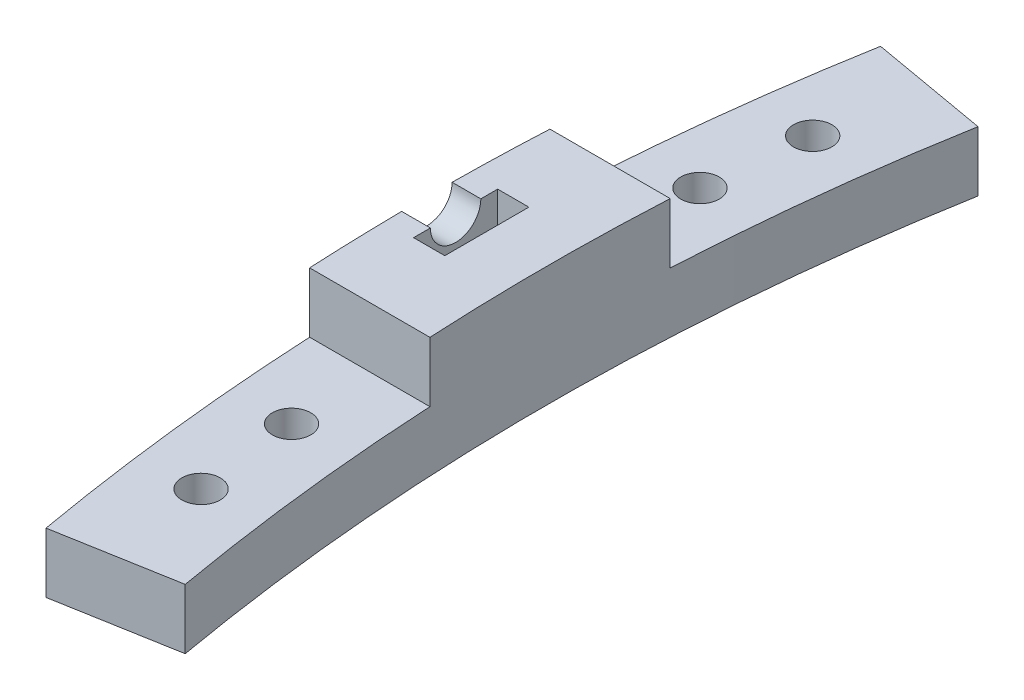
ISO-10303-21;
HEADER;
FILE_DESCRIPTION(('STEP AP214'),'2;1');
FILE_NAME('part.step','',(''),(''),'','','');
FILE_SCHEMA(('AUTOMOTIVE_DESIGN { 1 0 10303 214 1 1 1 1 }'));
ENDSEC;
DATA;
#1=APPLICATION_CONTEXT('core data for automotive mechanical design processes');
#2=APPLICATION_PROTOCOL_DEFINITION('international standard','automotive_design',2000,#1);
#3=PRODUCT_CONTEXT('',#1,'mechanical');
#4=PRODUCT('Part','Part','',(#3));
#5=PRODUCT_RELATED_PRODUCT_CATEGORY('part','',(#4));
#6=PRODUCT_DEFINITION_FORMATION('','',#4);
#7=PRODUCT_DEFINITION_CONTEXT('part definition',#1,'design');
#8=PRODUCT_DEFINITION('design','',#6,#7);
#9=PRODUCT_DEFINITION_SHAPE('','',#8);
#10=(LENGTH_UNIT() NAMED_UNIT(*) SI_UNIT(.MILLI.,.METRE.));
#11=(NAMED_UNIT(*) PLANE_ANGLE_UNIT() SI_UNIT($,.RADIAN.));
#12=(NAMED_UNIT(*) SI_UNIT($,.STERADIAN.) SOLID_ANGLE_UNIT());
#13=UNCERTAINTY_MEASURE_WITH_UNIT(LENGTH_MEASURE(1.E-05),#10,'distance_accuracy_value','');
#14=(GEOMETRIC_REPRESENTATION_CONTEXT(3) GLOBAL_UNCERTAINTY_ASSIGNED_CONTEXT((#13)) GLOBAL_UNIT_ASSIGNED_CONTEXT((#10,
#11,#12)) REPRESENTATION_CONTEXT('',''));
#15=CARTESIAN_POINT('',(0.,0.,0.));
#16=DIRECTION('',(0.,0.,1.));
#17=DIRECTION('',(1.,0.,0.));
#18=AXIS2_PLACEMENT_3D('',#15,#16,#17);
#19=CARTESIAN_POINT('',(0.,10.,0.));
#20=DIRECTION('',(0.,1.,0.));
#21=DIRECTION('',(0.,0.,1.));
#22=AXIS2_PLACEMENT_3D('',#19,#20,#21);
#23=PLANE('',#22);
#24=DIRECTION('',(0.,0.,-1.));
#25=VECTOR('',#24,1.);
#26=CARTESIAN_POINT('',(-197.6,10.,0.));
#27=LINE('',#26,#25);
#28=CARTESIAN_POINT('',(-197.6,10.,3.5));
#29=VERTEX_POINT('',#28);
#30=CARTESIAN_POINT('',(-197.6,10.,2.10000000000002));
#31=VERTEX_POINT('',#30);
#32=EDGE_CURVE('E11',#29,#31,#27,.T.);
#33=ORIENTED_EDGE('',*,*,#32,.T.);
#34=DIRECTION('',(1.,0.,0.));
#35=VECTOR('',#34,1.);
#36=CARTESIAN_POINT('',(-200.,10.,2.10000000000002));
#37=LINE('',#36,#35);
#38=CARTESIAN_POINT('',(-199.988974696107,10.,2.10000000000002));
#39=VERTEX_POINT('',#38);
#40=EDGE_CURVE('E48',#31,#39,#37,.F.);
#41=ORIENTED_EDGE('',*,*,#40,.T.);
#42=CARTESIAN_POINT('',(0.,10.,0.));
#43=DIRECTION('',(0.,1.,0.));
#44=DIRECTION('',(0.,0.,1.));
#45=AXIS2_PLACEMENT_3D('',#42,#43,#44);
#46=CIRCLE('',#45,200.);
#47=CARTESIAN_POINT('',(-199.749843554382,10.,10.));
#48=VERTEX_POINT('',#47);
#49=EDGE_CURVE('E206',#39,#48,#46,.T.);
#50=ORIENTED_EDGE('',*,*,#49,.T.);
#51=DIRECTION('',(1.,0.,0.));
#52=VECTOR('',#51,1.);
#53=CARTESIAN_POINT('',(-199.749843554382,10.,10.));
#54=LINE('',#53,#52);
#55=CARTESIAN_POINT('',(-189.736659610103,10.,9.99999999999993));
#56=VERTEX_POINT('',#55);
#57=EDGE_CURVE('E214',#48,#56,#54,.T.);
#58=ORIENTED_EDGE('',*,*,#57,.T.);
#59=CARTESIAN_POINT('',(0.,10.,0.));
#60=DIRECTION('',(0.,-1.,0.));
#61=DIRECTION('',(0.,0.,1.));
#62=AXIS2_PLACEMENT_3D('',#59,#60,#61);
#63=CIRCLE('',#62,190.);
#64=CARTESIAN_POINT('',(-189.736659610103,10.,-9.99999999999997));
#65=VERTEX_POINT('',#64);
#66=EDGE_CURVE('E212',#56,#65,#63,.T.);
#67=ORIENTED_EDGE('',*,*,#66,.T.);
#68=DIRECTION('',(-1.,0.,0.));
#69=VECTOR('',#68,1.);
#70=CARTESIAN_POINT('',(-199.749843554382,10.,-9.99999999999997));
#71=LINE('',#70,#69);
#72=CARTESIAN_POINT('',(-199.749843554382,10.,-9.99999999999997));
#73=VERTEX_POINT('',#72);
#74=EDGE_CURVE('E202',#65,#73,#71,.T.);
#75=ORIENTED_EDGE('',*,*,#74,.T.);
#76=CARTESIAN_POINT('',(-199.988974696107,10.,-2.09999999999998));
#77=VERTEX_POINT('',#76);
#78=EDGE_CURVE('E145',#73,#77,#46,.T.);
#79=ORIENTED_EDGE('',*,*,#78,.T.);
#80=DIRECTION('',(1.,0.,0.));
#81=VECTOR('',#80,1.);
#82=CARTESIAN_POINT('',(-200.,10.,-2.09999999999998));
#83=LINE('',#82,#81);
#84=CARTESIAN_POINT('',(-197.6,10.,-2.09999999999998));
#85=VERTEX_POINT('',#84);
#86=EDGE_CURVE('E134',#77,#85,#83,.T.);
#87=ORIENTED_EDGE('',*,*,#86,.T.);
#88=CARTESIAN_POINT('',(-197.6,10.,-3.5));
#89=VERTEX_POINT('',#88);
#90=EDGE_CURVE('E41',#85,#89,#27,.T.);
#91=ORIENTED_EDGE('',*,*,#90,.T.);
#92=DIRECTION('',(1.,0.,0.));
#93=VECTOR('',#92,1.);
#94=CARTESIAN_POINT('',(0.,10.,-3.5));
#95=LINE('',#94,#93);
#96=CARTESIAN_POINT('',(-195.,10.,-3.5));
#97=VERTEX_POINT('',#96);
#98=EDGE_CURVE('E151',#89,#97,#95,.T.);
#99=ORIENTED_EDGE('',*,*,#98,.T.);
#100=DIRECTION('',(0.,0.,-1.));
#101=VECTOR('',#100,1.);
#102=CARTESIAN_POINT('',(-195.,10.,0.));
#103=LINE('',#102,#101);
#104=CARTESIAN_POINT('',(-195.,10.,3.5));
#105=VERTEX_POINT('',#104);
#106=EDGE_CURVE('E155',#105,#97,#103,.T.);
#107=ORIENTED_EDGE('',*,*,#106,.F.);
#108=DIRECTION('',(-1.,0.,0.));
#109=VECTOR('',#108,1.);
#110=CARTESIAN_POINT('',(0.,10.,3.5));
#111=LINE('',#110,#109);
#112=EDGE_CURVE('E152',#105,#29,#111,.T.);
#113=ORIENTED_EDGE('',*,*,#112,.T.);
#114=EDGE_LOOP('',(#33,#41,#50,#58,#67,#75,#79,#87,#91,#99,#107,#113));
#115=FACE_BOUND('',#114,.T.);
#116=ADVANCED_FACE('F32',(#115),#23,.T.);
#117=CARTESIAN_POINT('',(0.,5.,0.));
#118=DIRECTION('',(0.,-1.,0.));
#119=DIRECTION('',(0.,0.,-1.));
#120=AXIS2_PLACEMENT_3D('',#117,#118,#119);
#121=CYLINDRICAL_SURFACE('',#120,200.);
#122=CARTESIAN_POINT('',(-199.988974696107,10.,-2.09999999999998));
#123=CARTESIAN_POINT('',(-199.988974549397,9.9409203116794,-2.099999609668));
#124=CARTESIAN_POINT('',(-199.989000909001,9.88186892998897,-2.09750528669672));
#125=CARTESIAN_POINT('',(-199.989105085795,9.76418873377178,-2.08755442879947));
#126=CARTESIAN_POINT('',(-199.989182900512,9.70555989906338,-2.08009813247565));
#127=CARTESIAN_POINT('',(-199.989490870308,9.53103376850107,-2.05035613277496));
#128=CARTESIAN_POINT('',(-199.989795560756,9.41630562543155,-2.02069712891339));
#129=CARTESIAN_POINT('',(-199.990569887448,9.19346269729487,-1.94254092909484));
#130=CARTESIAN_POINT('',(-199.991039600033,9.08535100033497,-1.89403501313448));
#131=CARTESIAN_POINT('',(-199.992090841183,8.8788107648244,-1.77956848824572));
#132=CARTESIAN_POINT('',(-199.992672347866,8.78038033699351,-1.7136112942068));
#133=CARTESIAN_POINT('',(-199.993881735917,8.59598710094805,-1.56610701377197));
#134=CARTESIAN_POINT('',(-199.994509619899,8.51002499608414,-1.48455904848602));
#135=CARTESIAN_POINT('',(-199.995741050064,8.3529969957832,-1.30817598665562));
#136=CARTESIAN_POINT('',(-199.996344592526,8.28193337085856,-1.21333886852744));
#137=CARTESIAN_POINT('',(-199.997459175993,8.15673917888833,-1.01308130566847));
#138=CARTESIAN_POINT('',(-199.997970218943,8.10260825562517,-0.907661083638772));
#139=CARTESIAN_POINT('',(-199.998842170904,8.01281685989472,-0.689235270836394));
#140=CARTESIAN_POINT('',(-199.999203089553,7.97715520168484,-0.576230167545882));
#141=CARTESIAN_POINT('',(-199.999734146089,7.92531021727368,-0.345838353320308));
#142=CARTESIAN_POINT('',(-199.999904287199,7.90912656184846,-0.22845171647802));
#143=CARTESIAN_POINT('',(-200.0000346193,7.89669590223241,0.0073752654532088));
#144=CARTESIAN_POINT('',(-199.999994805517,7.9004493511941,0.125815634431453));
#145=CARTESIAN_POINT('',(-199.999709712764,7.92778666787399,0.360379066723497));
#146=CARTESIAN_POINT('',(-199.999464443934,7.95136955674438,0.476502244132005));
#147=CARTESIAN_POINT('',(-199.99879610538,8.01769476085972,0.703140720662006));
#148=CARTESIAN_POINT('',(-199.998373036195,8.06043701784934,0.813656036833436));
#149=CARTESIAN_POINT('',(-199.99739676576,8.1638697402098,1.02594732878752));
#150=CARTESIAN_POINT('',(-199.996843558492,8.22456103553438,1.12772290016828));
#151=CARTESIAN_POINT('',(-199.995669417035,8.36216539396259,1.31963558051648));
#152=CARTESIAN_POINT('',(-199.995048486156,8.43907766413016,1.4097732580364));
#153=CARTESIAN_POINT('',(-199.993808920637,8.60693357582575,1.57585069775644));
#154=CARTESIAN_POINT('',(-199.993190285803,8.69787601035432,1.65179168004066));
#155=CARTESIAN_POINT('',(-199.992024801776,8.89125513292844,1.78735230568606));
#156=CARTESIAN_POINT('',(-199.991477975454,8.99369546377869,1.84696675572147));
#157=CARTESIAN_POINT('',(-199.99051770439,9.20717473696507,1.94817908914136));
#158=CARTESIAN_POINT('',(-199.990104341054,9.31821887622887,1.98976598181401));
#159=CARTESIAN_POINT('',(-199.989458694901,9.54562689657265,2.0536426889357));
#160=CARTESIAN_POINT('',(-199.989226135574,9.66198236519557,2.0759619756407));
#161=CARTESIAN_POINT('',(-199.989055994073,9.81592606917434,2.09224444740119));
#162=CARTESIAN_POINT('',(-199.989025522829,9.8527130619815,2.09515431534025));
#163=CARTESIAN_POINT('',(-199.988984901071,9.92632840389164,2.09902943646838));
#164=CARTESIAN_POINT('',(-199.988974717041,9.96315658405518,2.09999789687136));
#165=CARTESIAN_POINT('',(-199.988974696107,10.,2.10000000000002));
#166=B_SPLINE_CURVE_WITH_KNOTS('',3,(#122,#123,#124,#125,#126,#127,#128,#129,#130,#131,#132,
#133,#134,#135,#136,#137,#138,#139,#140,#141,#142,#143,#144,#145,#146,#147,#148,#149,#150,#151,
#152,#153,#154,#155,#156,#157,#158,#159,#160,#161,#162,#163,#164,#165),.UNSPECIFIED.,.F.,.F.,(4,
2,2,2,2,2,2,2,2,2,2,2,2,2,2,2,2,2,2,2,2,4),(0.,0.177130195021054,0.354251873150367,
0.707928868859306,1.06176969745937,1.41554133715475,1.76933292570932,2.12317839259232,
2.47701641503735,2.83083171796211,3.18464104049419,3.53845840482964,3.89225830457593,
4.24605712857745,4.5998723146019,4.95367020895172,5.30743768341722,5.66131755783631,
6.01541287688021,6.36896559744147,6.47963563046421,6.59012268493281),.UNSPECIFIED.);
#167=EDGE_CURVE('E228',#77,#39,#166,.T.);
#168=ORIENTED_EDGE('',*,*,#167,.F.);
#169=ORIENTED_EDGE('',*,*,#78,.F.);
#170=DIRECTION('',(0.,-1.,0.));
#171=VECTOR('',#170,1.);
#172=CARTESIAN_POINT('',(-199.749843554382,10.,-9.99999999999997));
#173=LINE('',#172,#171);
#174=CARTESIAN_POINT('',(-199.749843554382,5.,-9.99999999999997));
#175=VERTEX_POINT('',#174);
#176=EDGE_CURVE('E199',#73,#175,#173,.T.);
#177=ORIENTED_EDGE('',*,*,#176,.T.);
#178=CARTESIAN_POINT('',(0.,5.,0.));
#179=DIRECTION('',(0.,1.,0.));
#180=DIRECTION('',(0.,0.,1.));
#181=AXIS2_PLACEMENT_3D('',#178,#179,#180);
#182=CIRCLE('',#181,200.);
#183=CARTESIAN_POINT('',(-196.961550602442,5.,-34.729635533386));
#184=VERTEX_POINT('',#183);
#185=EDGE_CURVE('E189',#184,#175,#182,.T.);
#186=ORIENTED_EDGE('',*,*,#185,.F.);
#187=DIRECTION('',(0.,-1.,0.));
#188=VECTOR('',#187,1.);
#189=CARTESIAN_POINT('',(-196.961550602442,5.,-34.729635533386));
#190=LINE('',#189,#188);
#191=CARTESIAN_POINT('',(-196.961550602442,0.,-34.729635533386));
#192=VERTEX_POINT('',#191);
#193=EDGE_CURVE('E168',#184,#192,#190,.T.);
#194=ORIENTED_EDGE('',*,*,#193,.T.);
#195=CARTESIAN_POINT('',(0.,0.,0.));
#196=DIRECTION('',(0.,1.,0.));
#197=DIRECTION('',(0.,0.,1.));
#198=AXIS2_PLACEMENT_3D('',#195,#196,#197);
#199=CIRCLE('',#198,200.);
#200=CARTESIAN_POINT('',(-196.961550602442,0.,34.7296355333861));
#201=VERTEX_POINT('',#200);
#202=EDGE_CURVE('E179',#192,#201,#199,.T.);
#203=ORIENTED_EDGE('',*,*,#202,.T.);
#204=DIRECTION('',(0.,-1.,0.));
#205=VECTOR('',#204,1.);
#206=CARTESIAN_POINT('',(-196.961550602442,5.,34.7296355333861));
#207=LINE('',#206,#205);
#208=CARTESIAN_POINT('',(-196.961550602442,5.,34.7296355333861));
#209=VERTEX_POINT('',#208);
#210=EDGE_CURVE('E159',#209,#201,#207,.T.);
#211=ORIENTED_EDGE('',*,*,#210,.F.);
#212=CARTESIAN_POINT('',(-199.749843554382,5.,10.));
#213=VERTEX_POINT('',#212);
#214=EDGE_CURVE('E174',#213,#209,#182,.T.);
#215=ORIENTED_EDGE('',*,*,#214,.F.);
#216=DIRECTION('',(0.,-1.,0.));
#217=VECTOR('',#216,1.);
#218=CARTESIAN_POINT('',(-199.749843554382,10.,10.));
#219=LINE('',#218,#217);
#220=EDGE_CURVE('E182',#48,#213,#219,.T.);
#221=ORIENTED_EDGE('',*,*,#220,.F.);
#222=ORIENTED_EDGE('',*,*,#49,.F.);
#223=EDGE_LOOP('',(#168,#169,#177,#186,#194,#203,#211,#215,#221,#222));
#224=FACE_BOUND('',#223,.T.);
#225=ADVANCED_FACE('F34',(#224),#121,.T.);
#226=CARTESIAN_POINT('',(0.,5.,0.));
#227=DIRECTION('',(0.,1.,0.));
#228=DIRECTION('',(0.,0.,1.));
#229=AXIS2_PLACEMENT_3D('',#226,#227,#228);
#230=PLANE('',#229);
#231=CARTESIAN_POINT('',(-194.25796612789,5.,-16.9953698357934));
#232=DIRECTION('',(0.,1.,0.));
#233=DIRECTION('',(0.,0.,1.));
#234=AXIS2_PLACEMENT_3D('',#231,#232,#233);
#235=CIRCLE('',#234,1.59999999999999);
#236=CARTESIAN_POINT('',(-194.25796612789,5.,-15.3953698357934));
#237=VERTEX_POINT('',#236);
#238=EDGE_CURVE('E401',#237,#237,#235,.T.);
#239=ORIENTED_EDGE('',*,*,#238,.F.);
#240=EDGE_LOOP('',(#239));
#241=FACE_BOUND('',#240,.T.);
#242=CARTESIAN_POINT('',(-193.331747967893,5.,-25.4526074829103));
#243=DIRECTION('',(0.,1.,0.));
#244=DIRECTION('',(0.,0.,1.));
#245=AXIS2_PLACEMENT_3D('',#242,#243,#244);
#246=CIRCLE('',#245,1.59999999999999);
#247=CARTESIAN_POINT('',(-193.331747967893,5.,-23.8526074829103));
#248=VERTEX_POINT('',#247);
#249=EDGE_CURVE('E403',#248,#248,#246,.T.);
#250=ORIENTED_EDGE('',*,*,#249,.F.);
#251=EDGE_LOOP('',(#250));
#252=FACE_BOUND('',#251,.T.);
#253=DIRECTION('',(-1.,0.,0.));
#254=VECTOR('',#253,1.);
#255=CARTESIAN_POINT('',(-199.749843554382,5.,-9.99999999999997));
#256=LINE('',#255,#254);
#257=CARTESIAN_POINT('',(-189.736659610103,5.,-9.99999999999997));
#258=VERTEX_POINT('',#257);
#259=EDGE_CURVE('E203',#258,#175,#256,.T.);
#260=ORIENTED_EDGE('',*,*,#259,.F.);
#261=CARTESIAN_POINT('',(0.,5.,0.));
#262=DIRECTION('',(0.,-1.,0.));
#263=DIRECTION('',(0.,0.,1.));
#264=AXIS2_PLACEMENT_3D('',#261,#262,#263);
#265=CIRCLE('',#264,190.);
#266=CARTESIAN_POINT('',(-187.11347307232,5.,-32.9931537567167));
#267=VERTEX_POINT('',#266);
#268=EDGE_CURVE('E186',#258,#267,#265,.T.);
#269=ORIENTED_EDGE('',*,*,#268,.T.);
#270=DIRECTION('',(-0.984807753012208,0.,-0.17364817766693));
#271=VECTOR('',#270,1.);
#272=CARTESIAN_POINT('',(-196.961550602442,5.,-34.729635533386));
#273=LINE('',#272,#271);
#274=EDGE_CURVE('E171',#267,#184,#273,.T.);
#275=ORIENTED_EDGE('',*,*,#274,.T.);
#276=ORIENTED_EDGE('',*,*,#185,.T.);
#277=EDGE_LOOP('',(#260,#269,#275,#276));
#278=FACE_BOUND('',#277,.T.);
#279=ADVANCED_FACE('F279',(#241,#252,#278),#230,.T.);
#280=CARTESIAN_POINT('',(-187.11347307232,5.,32.9931537567168));
#281=DIRECTION('',(-0.17364817766693,0.,-0.984807753012208));
#282=DIRECTION('',(-0.984807753012208,0.,0.17364817766693));
#283=AXIS2_PLACEMENT_3D('',#280,#281,#282);
#284=PLANE('',#283);
#285=DIRECTION('',(0.984807753012208,0.,-0.17364817766693));
#286=VECTOR('',#285,1.);
#287=CARTESIAN_POINT('',(-187.11347307232,0.,32.9931537567168));
#288=LINE('',#287,#286);
#289=CARTESIAN_POINT('',(-187.11347307232,0.,32.9931537567167));
#290=VERTEX_POINT('',#289);
#291=EDGE_CURVE('E177',#201,#290,#288,.T.);
#292=ORIENTED_EDGE('',*,*,#291,.T.);
#293=DIRECTION('',(0.,-1.,0.));
#294=VECTOR('',#293,1.);
#295=CARTESIAN_POINT('',(-187.11347307232,5.,32.9931537567167));
#296=LINE('',#295,#294);
#297=CARTESIAN_POINT('',(-187.11347307232,5.,32.9931537567167));
#298=VERTEX_POINT('',#297);
#299=EDGE_CURVE('E162',#298,#290,#296,.T.);
#300=ORIENTED_EDGE('',*,*,#299,.F.);
#301=DIRECTION('',(0.984807753012208,0.,-0.17364817766693));
#302=VECTOR('',#301,1.);
#303=CARTESIAN_POINT('',(-187.11347307232,5.,32.9931537567168));
#304=LINE('',#303,#302);
#305=EDGE_CURVE('E187',#209,#298,#304,.T.);
#306=ORIENTED_EDGE('',*,*,#305,.F.);
#307=ORIENTED_EDGE('',*,*,#210,.T.);
#308=EDGE_LOOP('',(#292,#300,#306,#307));
#309=FACE_BOUND('',#308,.T.);
#310=ADVANCED_FACE('F288',(#309),#284,.F.);
#311=CARTESIAN_POINT('',(0.,5.,0.));
#312=DIRECTION('',(0.,-1.,0.));
#313=DIRECTION('',(0.,0.,-1.));
#314=AXIS2_PLACEMENT_3D('',#311,#312,#313);
#315=CYLINDRICAL_SURFACE('',#314,190.);
#316=CARTESIAN_POINT('',(0.,0.,0.));
#317=DIRECTION('',(0.,-1.,0.));
#318=DIRECTION('',(0.,0.,1.));
#319=AXIS2_PLACEMENT_3D('',#316,#317,#318);
#320=CIRCLE('',#319,190.);
#321=CARTESIAN_POINT('',(-187.11347307232,0.,-32.9931537567167));
#322=VERTEX_POINT('',#321);
#323=EDGE_CURVE('E175',#290,#322,#320,.T.);
#324=ORIENTED_EDGE('',*,*,#323,.T.);
#325=DIRECTION('',(0.,-1.,0.));
#326=VECTOR('',#325,1.);
#327=CARTESIAN_POINT('',(-187.11347307232,5.,-32.9931537567167));
#328=LINE('',#327,#326);
#329=EDGE_CURVE('E165',#267,#322,#328,.T.);
#330=ORIENTED_EDGE('',*,*,#329,.F.);
#331=ORIENTED_EDGE('',*,*,#268,.F.);
#332=DIRECTION('',(0.,-1.,0.));
#333=VECTOR('',#332,1.);
#334=CARTESIAN_POINT('',(-189.736659610103,10.,-9.99999999999997));
#335=LINE('',#334,#333);
#336=EDGE_CURVE('E196',#65,#258,#335,.T.);
#337=ORIENTED_EDGE('',*,*,#336,.F.);
#338=ORIENTED_EDGE('',*,*,#66,.F.);
#339=DIRECTION('',(0.,-1.,0.));
#340=VECTOR('',#339,1.);
#341=CARTESIAN_POINT('',(-189.736659610103,10.,9.99999999999993));
#342=LINE('',#341,#340);
#343=CARTESIAN_POINT('',(-189.736659610103,5.,9.99999999999993));
#344=VERTEX_POINT('',#343);
#345=EDGE_CURVE('E193',#56,#344,#342,.T.);
#346=ORIENTED_EDGE('',*,*,#345,.T.);
#347=EDGE_CURVE('E184',#298,#344,#265,.T.);
#348=ORIENTED_EDGE('',*,*,#347,.F.);
#349=ORIENTED_EDGE('',*,*,#299,.T.);
#350=EDGE_LOOP('',(#324,#330,#331,#337,#338,#346,#348,#349));
#351=FACE_BOUND('',#350,.T.);
#352=ADVANCED_FACE('F285',(#351),#315,.F.);
#353=CARTESIAN_POINT('',(-196.961550602442,5.,-34.729635533386));
#354=DIRECTION('',(-0.17364817766693,0.,0.984807753012208));
#355=DIRECTION('',(0.984807753012208,0.,0.17364817766693));
#356=AXIS2_PLACEMENT_3D('',#353,#354,#355);
#357=PLANE('',#356);
#358=DIRECTION('',(-0.984807753012208,0.,-0.17364817766693));
#359=VECTOR('',#358,1.);
#360=CARTESIAN_POINT('',(-196.961550602442,0.,-34.729635533386));
#361=LINE('',#360,#359);
#362=EDGE_CURVE('E172',#322,#192,#361,.T.);
#363=ORIENTED_EDGE('',*,*,#362,.T.);
#364=ORIENTED_EDGE('',*,*,#193,.F.);
#365=ORIENTED_EDGE('',*,*,#274,.F.);
#366=ORIENTED_EDGE('',*,*,#329,.T.);
#367=EDGE_LOOP('',(#363,#364,#365,#366));
#368=FACE_BOUND('',#367,.T.);
#369=ADVANCED_FACE('F277',(#368),#357,.F.);
#370=CARTESIAN_POINT('',(-194.25796612789,5.,16.9953698357934));
#371=DIRECTION('',(0.,1.,0.));
#372=DIRECTION('',(0.,0.,1.));
#373=AXIS2_PLACEMENT_3D('',#370,#371,#372);
#374=CIRCLE('',#373,1.59999999999999);
#375=CARTESIAN_POINT('',(-194.25796612789,5.,18.5953698357934));
#376=VERTEX_POINT('',#375);
#377=EDGE_CURVE('E411',#376,#376,#374,.T.);
#378=ORIENTED_EDGE('',*,*,#377,.F.);
#379=EDGE_LOOP('',(#378));
#380=FACE_BOUND('',#379,.T.);
#381=CARTESIAN_POINT('',(-193.331747967893,5.,25.4526074829103));
#382=DIRECTION('',(0.,1.,0.));
#383=DIRECTION('',(0.,0.,1.));
#384=AXIS2_PLACEMENT_3D('',#381,#382,#383);
#385=CIRCLE('',#384,1.59999999999999);
#386=CARTESIAN_POINT('',(-193.331747967893,5.,27.0526074829102));
#387=VERTEX_POINT('',#386);
#388=EDGE_CURVE('E417',#387,#387,#385,.T.);
#389=ORIENTED_EDGE('',*,*,#388,.F.);
#390=EDGE_LOOP('',(#389));
#391=FACE_BOUND('',#390,.T.);
#392=DIRECTION('',(1.,0.,0.));
#393=VECTOR('',#392,1.);
#394=CARTESIAN_POINT('',(-199.749843554382,5.,10.));
#395=LINE('',#394,#393);
#396=EDGE_CURVE('E207',#213,#344,#395,.T.);
#397=ORIENTED_EDGE('',*,*,#396,.F.);
#398=ORIENTED_EDGE('',*,*,#214,.T.);
#399=ORIENTED_EDGE('',*,*,#305,.T.);
#400=ORIENTED_EDGE('',*,*,#347,.T.);
#401=EDGE_LOOP('',(#397,#398,#399,#400));
#402=FACE_BOUND('',#401,.T.);
#403=ADVANCED_FACE('F274',(#380,#391,#402),#230,.T.);
#404=CARTESIAN_POINT('',(0.,0.,0.));
#405=DIRECTION('',(0.,1.,0.));
#406=DIRECTION('',(0.,0.,1.));
#407=AXIS2_PLACEMENT_3D('',#404,#405,#406);
#408=PLANE('',#407);
#409=CARTESIAN_POINT('',(-194.25796612789,0.,-16.9953698357934));
#410=DIRECTION('',(0.,1.,0.));
#411=DIRECTION('',(0.,0.,1.));
#412=AXIS2_PLACEMENT_3D('',#409,#410,#411);
#413=CIRCLE('',#412,1.59999999999999);
#414=CARTESIAN_POINT('',(-194.25796612789,0.,-15.3953698357934));
#415=VERTEX_POINT('',#414);
#416=EDGE_CURVE('E398',#415,#415,#413,.T.);
#417=ORIENTED_EDGE('',*,*,#416,.T.);
#418=EDGE_LOOP('',(#417));
#419=FACE_BOUND('',#418,.T.);
#420=CARTESIAN_POINT('',(-193.331747967893,0.,-25.4526074829103));
#421=DIRECTION('',(0.,1.,0.));
#422=DIRECTION('',(0.,0.,1.));
#423=AXIS2_PLACEMENT_3D('',#420,#421,#422);
#424=CIRCLE('',#423,1.59999999999999);
#425=CARTESIAN_POINT('',(-193.331747967893,0.,-23.8526074829103));
#426=VERTEX_POINT('',#425);
#427=EDGE_CURVE('E408',#426,#426,#424,.T.);
#428=ORIENTED_EDGE('',*,*,#427,.T.);
#429=EDGE_LOOP('',(#428));
#430=FACE_BOUND('',#429,.T.);
#431=CARTESIAN_POINT('',(-194.25796612789,0.,16.9953698357934));
#432=DIRECTION('',(0.,1.,0.));
#433=DIRECTION('',(0.,0.,1.));
#434=AXIS2_PLACEMENT_3D('',#431,#432,#433);
#435=CIRCLE('',#434,1.59999999999999);
#436=CARTESIAN_POINT('',(-194.25796612789,0.,18.5953698357934));
#437=VERTEX_POINT('',#436);
#438=EDGE_CURVE('E414',#437,#437,#435,.T.);
#439=ORIENTED_EDGE('',*,*,#438,.T.);
#440=EDGE_LOOP('',(#439));
#441=FACE_BOUND('',#440,.T.);
#442=CARTESIAN_POINT('',(-193.331747967893,0.,25.4526074829103));
#443=DIRECTION('',(0.,1.,0.));
#444=DIRECTION('',(0.,0.,1.));
#445=AXIS2_PLACEMENT_3D('',#442,#443,#444);
#446=CIRCLE('',#445,1.59999999999999);
#447=CARTESIAN_POINT('',(-193.331747967893,0.,27.0526074829102));
#448=VERTEX_POINT('',#447);
#449=EDGE_CURVE('E138',#448,#448,#446,.T.);
#450=ORIENTED_EDGE('',*,*,#449,.T.);
#451=EDGE_LOOP('',(#450));
#452=FACE_BOUND('',#451,.T.);
#453=ORIENTED_EDGE('',*,*,#202,.F.);
#454=ORIENTED_EDGE('',*,*,#362,.F.);
#455=ORIENTED_EDGE('',*,*,#323,.F.);
#456=ORIENTED_EDGE('',*,*,#291,.F.);
#457=EDGE_LOOP('',(#453,#454,#455,#456));
#458=FACE_BOUND('',#457,.T.);
#459=ADVANCED_FACE('F272',(#419,#430,#441,#452,#458),#408,.F.);
#460=CARTESIAN_POINT('',(-199.749843554382,10.,10.));
#461=DIRECTION('',(0.,0.,-1.));
#462=DIRECTION('',(-1.,0.,0.));
#463=AXIS2_PLACEMENT_3D('',#460,#461,#462);
#464=PLANE('',#463);
#465=ORIENTED_EDGE('',*,*,#396,.T.);
#466=ORIENTED_EDGE('',*,*,#345,.F.);
#467=ORIENTED_EDGE('',*,*,#57,.F.);
#468=ORIENTED_EDGE('',*,*,#220,.T.);
#469=EDGE_LOOP('',(#465,#466,#467,#468));
#470=FACE_BOUND('',#469,.T.);
#471=ADVANCED_FACE('F268',(#470),#464,.F.);
#472=CARTESIAN_POINT('',(-199.749843554382,10.,-9.99999999999997));
#473=DIRECTION('',(0.,0.,1.));
#474=DIRECTION('',(1.,0.,0.));
#475=AXIS2_PLACEMENT_3D('',#472,#473,#474);
#476=PLANE('',#475);
#477=ORIENTED_EDGE('',*,*,#259,.T.);
#478=ORIENTED_EDGE('',*,*,#176,.F.);
#479=ORIENTED_EDGE('',*,*,#74,.F.);
#480=ORIENTED_EDGE('',*,*,#336,.T.);
#481=EDGE_LOOP('',(#477,#478,#479,#480));
#482=FACE_BOUND('',#481,.T.);
#483=ADVANCED_FACE('F262',(#482),#476,.F.);
#484=CARTESIAN_POINT('',(-197.6,13.5,-3.5));
#485=DIRECTION('',(0.,0.,1.));
#486=DIRECTION('',(0.,-1.,0.));
#487=AXIS2_PLACEMENT_3D('',#484,#485,#486);
#488=PLANE('',#487);
#489=DIRECTION('',(0.,-1.,0.));
#490=VECTOR('',#489,1.);
#491=CARTESIAN_POINT('',(-197.6,13.5,-3.5));
#492=LINE('',#491,#490);
#493=CARTESIAN_POINT('',(-197.6,6.5,-3.5));
#494=VERTEX_POINT('',#493);
#495=EDGE_CURVE('E150',#89,#494,#492,.T.);
#496=ORIENTED_EDGE('',*,*,#495,.T.);
#497=DIRECTION('',(1.,0.,0.));
#498=VECTOR('',#497,1.);
#499=CARTESIAN_POINT('',(-197.6,6.5,-3.5));
#500=LINE('',#499,#498);
#501=CARTESIAN_POINT('',(-195.,6.5,-3.5));
#502=VERTEX_POINT('',#501);
#503=EDGE_CURVE('E210',#494,#502,#500,.T.);
#504=ORIENTED_EDGE('',*,*,#503,.T.);
#505=DIRECTION('',(0.,-1.,0.));
#506=VECTOR('',#505,1.);
#507=CARTESIAN_POINT('',(-195.,13.5,-3.5));
#508=LINE('',#507,#506);
#509=EDGE_CURVE('E226',#97,#502,#508,.T.);
#510=ORIENTED_EDGE('',*,*,#509,.F.);
#511=ORIENTED_EDGE('',*,*,#98,.F.);
#512=EDGE_LOOP('',(#496,#504,#510,#511));
#513=FACE_BOUND('',#512,.T.);
#514=ADVANCED_FACE('F258',(#513),#488,.T.);
#515=CARTESIAN_POINT('',(-197.6,6.5,3.5));
#516=DIRECTION('',(0.,1.,0.));
#517=DIRECTION('',(0.,0.,1.));
#518=AXIS2_PLACEMENT_3D('',#515,#516,#517);
#519=PLANE('',#518);
#520=DIRECTION('',(0.,0.,1.));
#521=VECTOR('',#520,1.);
#522=CARTESIAN_POINT('',(-195.,6.5,3.5));
#523=LINE('',#522,#521);
#524=CARTESIAN_POINT('',(-195.,6.5,3.5));
#525=VERTEX_POINT('',#524);
#526=EDGE_CURVE('E224',#502,#525,#523,.T.);
#527=ORIENTED_EDGE('',*,*,#526,.F.);
#528=ORIENTED_EDGE('',*,*,#503,.F.);
#529=DIRECTION('',(0.,0.,1.));
#530=VECTOR('',#529,1.);
#531=CARTESIAN_POINT('',(-197.6,6.5,3.5));
#532=LINE('',#531,#530);
#533=CARTESIAN_POINT('',(-197.6,6.5,3.5));
#534=VERTEX_POINT('',#533);
#535=EDGE_CURVE('E231',#494,#534,#532,.T.);
#536=ORIENTED_EDGE('',*,*,#535,.T.);
#537=DIRECTION('',(1.,0.,0.));
#538=VECTOR('',#537,1.);
#539=CARTESIAN_POINT('',(-197.6,6.5,3.5));
#540=LINE('',#539,#538);
#541=EDGE_CURVE('E219',#534,#525,#540,.T.);
#542=ORIENTED_EDGE('',*,*,#541,.T.);
#543=EDGE_LOOP('',(#527,#528,#536,#542));
#544=FACE_BOUND('',#543,.T.);
#545=ADVANCED_FACE('F254',(#544),#519,.T.);
#546=CARTESIAN_POINT('',(-197.6,13.5,3.5));
#547=DIRECTION('',(0.,0.,-1.));
#548=DIRECTION('',(0.,1.,0.));
#549=AXIS2_PLACEMENT_3D('',#546,#547,#548);
#550=PLANE('',#549);
#551=DIRECTION('',(0.,1.,0.));
#552=VECTOR('',#551,1.);
#553=CARTESIAN_POINT('',(-195.,13.5,3.5));
#554=LINE('',#553,#552);
#555=EDGE_CURVE('E56',#525,#105,#554,.T.);
#556=ORIENTED_EDGE('',*,*,#555,.F.);
#557=ORIENTED_EDGE('',*,*,#541,.F.);
#558=DIRECTION('',(0.,1.,0.));
#559=VECTOR('',#558,1.);
#560=CARTESIAN_POINT('',(-197.6,13.5,3.5));
#561=LINE('',#560,#559);
#562=EDGE_CURVE('E222',#534,#29,#561,.T.);
#563=ORIENTED_EDGE('',*,*,#562,.T.);
#564=ORIENTED_EDGE('',*,*,#112,.F.);
#565=EDGE_LOOP('',(#556,#557,#563,#564));
#566=FACE_BOUND('',#565,.T.);
#567=ADVANCED_FACE('F249',(#566),#550,.T.);
#568=CARTESIAN_POINT('',(-197.6,0.,0.));
#569=DIRECTION('',(1.,0.,0.));
#570=DIRECTION('',(0.,0.,-1.));
#571=AXIS2_PLACEMENT_3D('',#568,#569,#570);
#572=PLANE('',#571);
#573=ORIENTED_EDGE('',*,*,#90,.F.);
#574=CARTESIAN_POINT('',(-197.6,10.,0.));
#575=DIRECTION('',(1.,0.,0.));
#576=DIRECTION('',(0.,0.,-1.));
#577=AXIS2_PLACEMENT_3D('',#574,#575,#576);
#578=CIRCLE('',#577,2.1);
#579=EDGE_CURVE('E131',#85,#31,#578,.F.);
#580=ORIENTED_EDGE('',*,*,#579,.T.);
#581=ORIENTED_EDGE('',*,*,#32,.F.);
#582=ORIENTED_EDGE('',*,*,#562,.F.);
#583=ORIENTED_EDGE('',*,*,#535,.F.);
#584=ORIENTED_EDGE('',*,*,#495,.F.);
#585=EDGE_LOOP('',(#573,#580,#581,#582,#583,#584));
#586=FACE_BOUND('',#585,.T.);
#587=ADVANCED_FACE('F148',(#586),#572,.T.);
#588=CARTESIAN_POINT('',(-195.,0.,0.));
#589=DIRECTION('',(1.,0.,0.));
#590=DIRECTION('',(0.,0.,-1.));
#591=AXIS2_PLACEMENT_3D('',#588,#589,#590);
#592=PLANE('',#591);
#593=ORIENTED_EDGE('',*,*,#106,.T.);
#594=ORIENTED_EDGE('',*,*,#509,.T.);
#595=ORIENTED_EDGE('',*,*,#526,.T.);
#596=ORIENTED_EDGE('',*,*,#555,.T.);
#597=EDGE_LOOP('',(#593,#594,#595,#596));
#598=FACE_BOUND('',#597,.T.);
#599=ADVANCED_FACE('F245',(#598),#592,.F.);
#600=CARTESIAN_POINT('',(-200.,10.,0.));
#601=DIRECTION('',(1.,0.,0.));
#602=DIRECTION('',(0.,0.,-1.));
#603=AXIS2_PLACEMENT_3D('',#600,#601,#602);
#604=CYLINDRICAL_SURFACE('',#603,2.1);
#605=ORIENTED_EDGE('',*,*,#167,.T.);
#606=ORIENTED_EDGE('',*,*,#40,.F.);
#607=ORIENTED_EDGE('',*,*,#579,.F.);
#608=ORIENTED_EDGE('',*,*,#86,.F.);
#609=EDGE_LOOP('',(#605,#606,#607,#608));
#610=FACE_BOUND('',#609,.T.);
#611=ADVANCED_FACE('F133',(#610),#604,.F.);
#612=CARTESIAN_POINT('',(-193.331747967893,5.,25.4526074829103));
#613=DIRECTION('',(0.,1.,0.));
#614=DIRECTION('',(0.,0.,1.));
#615=AXIS2_PLACEMENT_3D('',#612,#613,#614);
#616=CYLINDRICAL_SURFACE('',#615,1.59999999999999);
#617=ORIENTED_EDGE('',*,*,#449,.F.);
#618=EDGE_LOOP('',(#617));
#619=FACE_BOUND('',#618,.T.);
#620=ORIENTED_EDGE('',*,*,#388,.T.);
#621=EDGE_LOOP('',(#620));
#622=FACE_BOUND('',#621,.T.);
#623=ADVANCED_FACE('F244',(#619,#622),#616,.F.);
#624=CARTESIAN_POINT('',(-194.25796612789,5.,16.9953698357934));
#625=DIRECTION('',(0.,1.,0.));
#626=DIRECTION('',(0.,0.,1.));
#627=AXIS2_PLACEMENT_3D('',#624,#625,#626);
#628=CYLINDRICAL_SURFACE('',#627,1.59999999999999);
#629=ORIENTED_EDGE('',*,*,#438,.F.);
#630=EDGE_LOOP('',(#629));
#631=FACE_BOUND('',#630,.T.);
#632=ORIENTED_EDGE('',*,*,#377,.T.);
#633=EDGE_LOOP('',(#632));
#634=FACE_BOUND('',#633,.T.);
#635=ADVANCED_FACE('F363',(#631,#634),#628,.F.);
#636=CARTESIAN_POINT('',(-193.331747967893,5.,-25.4526074829103));
#637=DIRECTION('',(0.,1.,0.));
#638=DIRECTION('',(0.,0.,1.));
#639=AXIS2_PLACEMENT_3D('',#636,#637,#638);
#640=CYLINDRICAL_SURFACE('',#639,1.59999999999999);
#641=ORIENTED_EDGE('',*,*,#427,.F.);
#642=EDGE_LOOP('',(#641));
#643=FACE_BOUND('',#642,.T.);
#644=ORIENTED_EDGE('',*,*,#249,.T.);
#645=EDGE_LOOP('',(#644));
#646=FACE_BOUND('',#645,.T.);
#647=ADVANCED_FACE('F372',(#643,#646),#640,.F.);
#648=CARTESIAN_POINT('',(-194.25796612789,5.,-16.9953698357934));
#649=DIRECTION('',(0.,1.,0.));
#650=DIRECTION('',(0.,0.,1.));
#651=AXIS2_PLACEMENT_3D('',#648,#649,#650);
#652=CYLINDRICAL_SURFACE('',#651,1.59999999999999);
#653=ORIENTED_EDGE('',*,*,#416,.F.);
#654=EDGE_LOOP('',(#653));
#655=FACE_BOUND('',#654,.T.);
#656=ORIENTED_EDGE('',*,*,#238,.T.);
#657=EDGE_LOOP('',(#656));
#658=FACE_BOUND('',#657,.T.);
#659=ADVANCED_FACE('F381',(#655,#658),#652,.F.);
#660=CLOSED_SHELL('',(#116,#225,#279,#310,#352,#369,#403,#459,#471,#483,#514,#545,#567,#587,
#599,#611,#623,#635,#647,#659));
#661=MANIFOLD_SOLID_BREP('B2',#660);
#662=ADVANCED_BREP_SHAPE_REPRESENTATION('',(#18,#661),#14);
#663=SHAPE_DEFINITION_REPRESENTATION(#9,#662);
ENDSEC;
END-ISO-10303-21;
